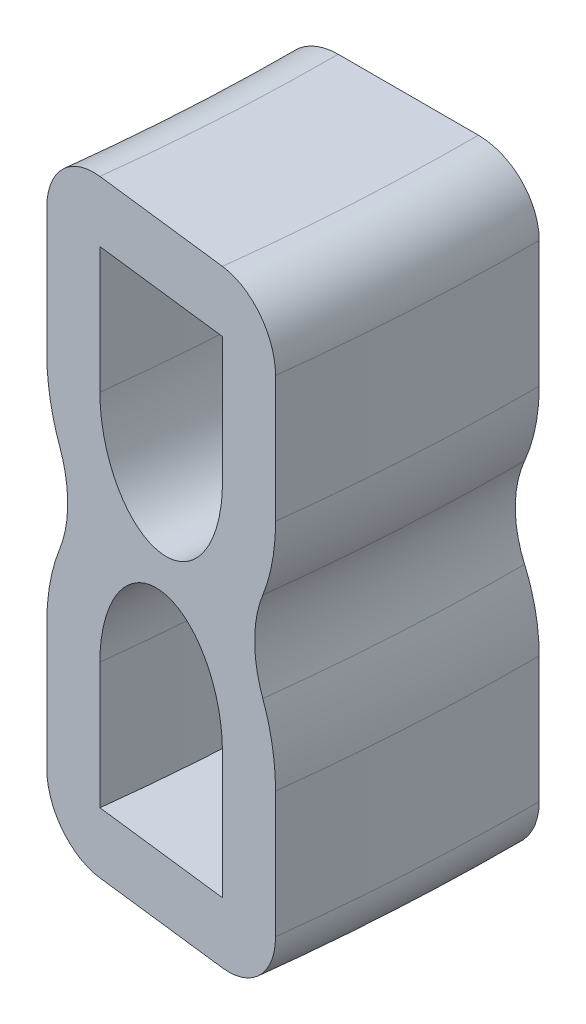
ISO-10303-21;
HEADER;
FILE_DESCRIPTION(('STEP AP214'),'2;1');
FILE_NAME('part.step','',(''),(''),'','','');
FILE_SCHEMA(('AUTOMOTIVE_DESIGN { 1 0 10303 214 1 1 1 1 }'));
ENDSEC;
DATA;
#1=APPLICATION_CONTEXT('core data for automotive mechanical design processes');
#2=APPLICATION_PROTOCOL_DEFINITION('international standard','automotive_design',2000,#1);
#3=PRODUCT_CONTEXT('',#1,'mechanical');
#4=PRODUCT('Part','Part','',(#3));
#5=PRODUCT_RELATED_PRODUCT_CATEGORY('part','',(#4));
#6=PRODUCT_DEFINITION_FORMATION('','',#4);
#7=PRODUCT_DEFINITION_CONTEXT('part definition',#1,'design');
#8=PRODUCT_DEFINITION('design','',#6,#7);
#9=PRODUCT_DEFINITION_SHAPE('','',#8);
#10=(LENGTH_UNIT() NAMED_UNIT(*) SI_UNIT(.MILLI.,.METRE.));
#11=(NAMED_UNIT(*) PLANE_ANGLE_UNIT() SI_UNIT($,.RADIAN.));
#12=(NAMED_UNIT(*) SI_UNIT($,.STERADIAN.) SOLID_ANGLE_UNIT());
#13=UNCERTAINTY_MEASURE_WITH_UNIT(LENGTH_MEASURE(1.E-05),#10,'distance_accuracy_value','');
#14=(GEOMETRIC_REPRESENTATION_CONTEXT(3) GLOBAL_UNCERTAINTY_ASSIGNED_CONTEXT((#13)) GLOBAL_UNIT_ASSIGNED_CONTEXT((#10,
#11,#12)) REPRESENTATION_CONTEXT('',''));
#15=CARTESIAN_POINT('',(0.,0.,0.));
#16=DIRECTION('',(0.,0.,1.));
#17=DIRECTION('',(1.,0.,0.));
#18=AXIS2_PLACEMENT_3D('',#15,#16,#17);
#19=CARTESIAN_POINT('',(-1.5,10.2,0.));
#20=DIRECTION('',(0.,1.,0.));
#21=DIRECTION('',(0.,0.,1.));
#22=AXIS2_PLACEMENT_3D('',#19,#20,#21);
#23=PLANE('',#22);
#24=CARTESIAN_POINT('',(-42.,10.2,0.));
#25=DIRECTION('',(0.,-1.,0.));
#26=DIRECTION('',(1.,0.,0.));
#27=AXIS2_PLACEMENT_3D('',#24,#25,#26);
#28=CIRCLE('',#27,40.5);
#29=CARTESIAN_POINT('',(-1.5,10.2,0.));
#30=VERTEX_POINT('',#29);
#31=CARTESIAN_POINT('',(-1.78698979591837,10.2,4.81287962933071));
#32=VERTEX_POINT('',#31);
#33=EDGE_CURVE('E280',#30,#32,#28,.T.);
#34=ORIENTED_EDGE('',*,*,#33,.T.);
#35=DIRECTION('',(-0.992913832199547,0.,-0.118836534057548));
#36=VECTOR('',#35,1.);
#37=CARTESIAN_POINT('',(-1.78698979591837,10.2,4.81287962933071));
#38=LINE('',#37,#36);
#39=CARTESIAN_POINT('',(1.19175170068027,10.2,5.16938923150335));
#40=VERTEX_POINT('',#39);
#41=EDGE_CURVE('E362',#40,#32,#38,.T.);
#42=ORIENTED_EDGE('',*,*,#41,.F.);
#43=CARTESIAN_POINT('',(-42.,10.2,0.));
#44=DIRECTION('',(0.,-1.,0.));
#45=DIRECTION('',(1.,0.,0.));
#46=AXIS2_PLACEMENT_3D('',#43,#44,#45);
#47=CIRCLE('',#46,43.5);
#48=CARTESIAN_POINT('',(1.5,10.2,0.));
#49=VERTEX_POINT('',#48);
#50=EDGE_CURVE('E285',#49,#40,#47,.T.);
#51=ORIENTED_EDGE('',*,*,#50,.F.);
#52=DIRECTION('',(-1.,0.,0.));
#53=VECTOR('',#52,1.);
#54=CARTESIAN_POINT('',(-1.5,10.2,0.));
#55=LINE('',#54,#53);
#56=EDGE_CURVE('E254',#49,#30,#55,.T.);
#57=ORIENTED_EDGE('',*,*,#56,.T.);
#58=EDGE_LOOP('',(#34,#42,#51,#57));
#59=FACE_BOUND('',#58,.T.);
#60=ADVANCED_FACE('F39',(#59),#23,.T.);
#61=CARTESIAN_POINT('',(-42.,8.9,0.));
#62=DIRECTION('',(0.,-1.,0.));
#63=DIRECTION('',(0.,0.,-1.));
#64=AXIS2_PLACEMENT_3D('',#61,#62,#63);
#65=TOROIDAL_SURFACE('',#64,40.5,1.3);
#66=CARTESIAN_POINT('',(-42.,8.9,0.));
#67=DIRECTION('',(0.,-1.,0.));
#68=DIRECTION('',(1.,0.,0.));
#69=AXIS2_PLACEMENT_3D('',#66,#67,#68);
#70=CIRCLE('',#69,39.2);
#71=CARTESIAN_POINT('',(-2.8,8.9,0.));
#72=VERTEX_POINT('',#71);
#73=CARTESIAN_POINT('',(-3.07777777777778,8.9,4.6583921350559));
#74=VERTEX_POINT('',#73);
#75=EDGE_CURVE('E284',#72,#74,#70,.T.);
#76=ORIENTED_EDGE('',*,*,#75,.T.);
#77=CARTESIAN_POINT('',(-1.78698979591837,8.9,4.81287962933071));
#78=DIRECTION('',(-0.118836534057548,0.,0.992913832199547));
#79=DIRECTION('',(0.992913832199547,0.,0.118836534057548));
#80=AXIS2_PLACEMENT_3D('',#77,#78,#79);
#81=CIRCLE('',#80,1.3);
#82=EDGE_CURVE('E216',#32,#74,#81,.T.);
#83=ORIENTED_EDGE('',*,*,#82,.F.);
#84=ORIENTED_EDGE('',*,*,#33,.F.);
#85=CARTESIAN_POINT('',(-1.5,8.9,0.));
#86=DIRECTION('',(0.,0.,1.));
#87=DIRECTION('',(1.,0.,0.));
#88=AXIS2_PLACEMENT_3D('',#85,#86,#87);
#89=CIRCLE('',#88,1.3);
#90=EDGE_CURVE('E251',#30,#72,#89,.T.);
#91=ORIENTED_EDGE('',*,*,#90,.T.);
#92=EDGE_LOOP('',(#76,#83,#84,#91));
#93=FACE_BOUND('',#92,.T.);
#94=ADVANCED_FACE('F694',(#93),#65,.T.);
#95=CARTESIAN_POINT('',(-42.,0.,0.));
#96=DIRECTION('',(0.,-1.,0.));
#97=DIRECTION('',(0.,0.,-1.));
#98=AXIS2_PLACEMENT_3D('',#95,#96,#97);
#99=CYLINDRICAL_SURFACE('',#98,39.2);
#100=CARTESIAN_POINT('',(-42.,6.2,0.));
#101=DIRECTION('',(0.,-1.,0.));
#102=DIRECTION('',(1.,0.,0.));
#103=AXIS2_PLACEMENT_3D('',#100,#101,#102);
#104=CIRCLE('',#103,39.2);
#105=CARTESIAN_POINT('',(-2.8,6.2,0.));
#106=VERTEX_POINT('',#105);
#107=CARTESIAN_POINT('',(-3.07777777777778,6.2,4.6583921350559));
#108=VERTEX_POINT('',#107);
#109=EDGE_CURVE('E292',#106,#108,#104,.T.);
#110=ORIENTED_EDGE('',*,*,#109,.T.);
#111=DIRECTION('',(0.,-1.,0.));
#112=VECTOR('',#111,1.);
#113=CARTESIAN_POINT('',(-3.07777777777778,8.9,4.6583921350559));
#114=LINE('',#113,#112);
#115=EDGE_CURVE('E220',#74,#108,#114,.T.);
#116=ORIENTED_EDGE('',*,*,#115,.F.);
#117=ORIENTED_EDGE('',*,*,#75,.F.);
#118=DIRECTION('',(0.,-1.,0.));
#119=VECTOR('',#118,1.);
#120=CARTESIAN_POINT('',(-2.8,8.9,0.));
#121=LINE('',#120,#119);
#122=EDGE_CURVE('E247',#72,#106,#121,.T.);
#123=ORIENTED_EDGE('',*,*,#122,.T.);
#124=EDGE_LOOP('',(#110,#116,#117,#123));
#125=FACE_BOUND('',#124,.T.);
#126=ADVANCED_FACE('F685',(#125),#99,.F.);
#127=CARTESIAN_POINT('',(-2.8,6.2,0.));
#128=CARTESIAN_POINT('',(-2.8,6.2,1.55739651651361));
#129=CARTESIAN_POINT('',(-2.89270217360201,6.2,3.11203159159014));
#130=CARTESIAN_POINT('',(-3.07777777777778,6.2,4.6583921350559));
#131=CARTESIAN_POINT('',(-2.8,5.65789056924837,0.));
#132=CARTESIAN_POINT('',(-2.8,5.65789056924837,1.55739651651361));
#133=CARTESIAN_POINT('',(-2.89270217360201,5.65789056924837,3.11203159159014));
#134=CARTESIAN_POINT('',(-3.07777777777778,5.65789056924837,4.6583921350559));
#135=CARTESIAN_POINT('',(-2.69365136890083,5.13316020158605,0.));
#136=CARTESIAN_POINT('',(-2.69365136890083,5.13316020158605,1.56162169476897));
#137=CARTESIAN_POINT('',(-2.78660504120852,5.13316020158605,3.12047445637848));
#138=CARTESIAN_POINT('',(-2.97218275092394,5.13316020158605,4.67103023777749));
#139=CARTESIAN_POINT('',(-2.48777280220747,4.65945273955546,0.));
#140=CARTESIAN_POINT('',(-2.48777280220747,4.65945273955546,1.56980114789634));
#141=CARTESIAN_POINT('',(-2.58121334672512,4.65945273955546,3.13681885953106));
#142=CARTESIAN_POINT('',(-2.76776307430068,4.65945273955546,4.69549613308006));
#143=(BOUNDED_SURFACE() B_SPLINE_SURFACE(3,3,((#127,#128,#129,#130),(#131,#132,#133,#134),(#135,
#136,#137,#138),(#139,#140,#141,#142)),.UNSPECIFIED.,.F.,.F.,
.F.) B_SPLINE_SURFACE_WITH_KNOTS((4,4),(4,4),(0.,1.),(0.,1.),
.UNSPECIFIED.) GEOMETRIC_REPRESENTATION_ITEM() RATIONAL_B_SPLINE_SURFACE(((1.,0.998817924055604,
0.998817924055604,1.),(0.978627853709388,0.977471041265003,0.977471041265003,0.978627853709388),
(0.978627853709388,0.977471041265003,0.977471041265003,0.978627853709388),(1.,0.998817924055604,
0.998817924055604,1.))) REPRESENTATION_ITEM('') SURFACE());
#144=CARTESIAN_POINT('',(-42.,4.65945273955546,0.));
#145=DIRECTION('',(0.,-1.,0.));
#146=DIRECTION('',(1.,0.,0.));
#147=AXIS2_PLACEMENT_3D('',#144,#145,#146);
#148=CIRCLE('',#147,39.5122271977925);
#149=CARTESIAN_POINT('',(-2.48777280220747,4.65945273955546,0.));
#150=VERTEX_POINT('',#149);
#151=CARTESIAN_POINT('',(-2.76776307430068,4.65945273955546,4.69549613308006));
#152=VERTEX_POINT('',#151);
#153=EDGE_CURVE('E296',#150,#152,#148,.T.);
#154=CARTESIAN_POINT('',(-0.620803255421781,6.2,4.95245424501531));
#155=DIRECTION('',(-0.118836534057548,0.,0.992913832199547));
#156=DIRECTION('',(0.,1.,0.));
#157=AXIS2_PLACEMENT_3D('',#154,#155,#156);
#158=ELLIPSE('',#157,3.16825385762719,2.47450931055437);
#159=EDGE_CURVE('E389',#108,#152,#158,.T.);
#160=CARTESIAN_POINT('',(-0.325490689445631,6.2,0.));
#161=DIRECTION('',(0.,0.,1.));
#162=DIRECTION('',(0.,1.,0.));
#163=AXIS2_PLACEMENT_3D('',#160,#161,#162);
#164=ELLIPSE('',#163,3.16825385762719,2.47450931055437);
#165=EDGE_CURVE('E250',#106,#150,#164,.T.);
#166=ORIENTED_EDGE('',*,*,#153,.T.);
#167=ORIENTED_EDGE('',*,*,#159,.F.);
#168=ORIENTED_EDGE('',*,*,#109,.F.);
#169=ORIENTED_EDGE('',*,*,#165,.T.);
#170=EDGE_LOOP('',(#166,#167,#168,#169));
#171=FACE_BOUND('',#170,.T.);
#172=ADVANCED_FACE('F676',(#171),#143,.T.);
#173=CARTESIAN_POINT('',(-42.,3.7,0.));
#174=DIRECTION('',(0.,-1.,0.));
#175=DIRECTION('',(0.,0.,-1.));
#176=AXIS2_PLACEMENT_3D('',#173,#174,#175);
#177=TOROIDAL_SURFACE('',#176,37.304615548397,2.40709342444103);
#178=CARTESIAN_POINT('',(-42.,2.74054726044454,0.));
#179=DIRECTION('',(0.,-1.,0.));
#180=DIRECTION('',(1.,0.,0.));
#181=AXIS2_PLACEMENT_3D('',#178,#179,#180);
#182=CIRCLE('',#181,39.5122271977925);
#183=CARTESIAN_POINT('',(-2.48777280220747,2.74054726044454,0.));
#184=VERTEX_POINT('',#183);
#185=CARTESIAN_POINT('',(-2.76776307430068,2.74054726044454,4.69549613308006));
#186=VERTEX_POINT('',#185);
#187=EDGE_CURVE('E300',#184,#186,#182,.T.);
#188=ORIENTED_EDGE('',*,*,#187,.T.);
#189=CARTESIAN_POINT('',(-4.95973121711033,3.7,4.43315121612083));
#190=DIRECTION('',(0.118836534057548,0.,-0.992913832199547));
#191=DIRECTION('',(0.992913832199547,0.,0.118836534057548));
#192=AXIS2_PLACEMENT_3D('',#189,#190,#191);
#193=CIRCLE('',#192,2.40709342444103);
#194=EDGE_CURVE('E385',#152,#186,#193,.T.);
#195=ORIENTED_EDGE('',*,*,#194,.F.);
#196=ORIENTED_EDGE('',*,*,#153,.F.);
#197=CARTESIAN_POINT('',(-4.69538445160298,3.7,0.));
#198=DIRECTION('',(0.,0.,-1.));
#199=DIRECTION('',(1.,0.,0.));
#200=AXIS2_PLACEMENT_3D('',#197,#198,#199);
#201=CIRCLE('',#200,2.40709342444103);
#202=EDGE_CURVE('E246',#150,#184,#201,.T.);
#203=ORIENTED_EDGE('',*,*,#202,.T.);
#204=EDGE_LOOP('',(#188,#195,#196,#203));
#205=FACE_BOUND('',#204,.T.);
#206=ADVANCED_FACE('F667',(#205),#177,.F.);
#207=CARTESIAN_POINT('',(-2.48777280220747,2.74054726044454,0.));
#208=CARTESIAN_POINT('',(-2.48777280220747,2.74054726044454,1.56980114789634));
#209=CARTESIAN_POINT('',(-2.58121334672512,2.74054726044454,3.13681885953106));
#210=CARTESIAN_POINT('',(-2.76776307430068,2.74054726044454,4.69549613308006));
#211=CARTESIAN_POINT('',(-2.69365136890083,2.26683979841396,0.));
#212=CARTESIAN_POINT('',(-2.69365136890083,2.26683979841396,1.56162169476897));
#213=CARTESIAN_POINT('',(-2.78660504120852,2.26683979841396,3.12047445637848));
#214=CARTESIAN_POINT('',(-2.97218275092394,2.26683979841396,4.67103023777749));
#215=CARTESIAN_POINT('',(-2.8,1.74210943075164,0.));
#216=CARTESIAN_POINT('',(-2.8,1.74210943075164,1.55739651651361));
#217=CARTESIAN_POINT('',(-2.89270217360201,1.74210943075164,3.11203159159014));
#218=CARTESIAN_POINT('',(-3.07777777777778,1.74210943075164,4.6583921350559));
#219=CARTESIAN_POINT('',(-2.8,1.2,0.));
#220=CARTESIAN_POINT('',(-2.8,1.2,1.55739651651361));
#221=CARTESIAN_POINT('',(-2.89270217360201,1.2,3.11203159159014));
#222=CARTESIAN_POINT('',(-3.07777777777778,1.2,4.6583921350559));
#223=(BOUNDED_SURFACE() B_SPLINE_SURFACE(3,3,((#207,#208,#209,#210),(#211,#212,#213,#214),(#215,
#216,#217,#218),(#219,#220,#221,#222)),.UNSPECIFIED.,.F.,.F.,
.F.) B_SPLINE_SURFACE_WITH_KNOTS((4,4),(4,4),(0.,1.),(0.,1.),
.UNSPECIFIED.) GEOMETRIC_REPRESENTATION_ITEM() RATIONAL_B_SPLINE_SURFACE(((1.,0.998817924055604,
0.998817924055604,1.),(0.978627853709388,0.977471041265003,0.977471041265003,0.978627853709388),
(0.978627853709388,0.977471041265003,0.977471041265003,0.978627853709388),(1.,0.998817924055604,
0.998817924055604,1.))) REPRESENTATION_ITEM('') SURFACE());
#224=CARTESIAN_POINT('',(-42.,1.2,0.));
#225=DIRECTION('',(0.,-1.,0.));
#226=DIRECTION('',(1.,0.,0.));
#227=AXIS2_PLACEMENT_3D('',#224,#225,#226);
#228=CIRCLE('',#227,39.2);
#229=CARTESIAN_POINT('',(-2.8,1.2,0.));
#230=VERTEX_POINT('',#229);
#231=CARTESIAN_POINT('',(-3.07777777777778,1.2,4.6583921350559));
#232=VERTEX_POINT('',#231);
#233=EDGE_CURVE('E304',#230,#232,#228,.T.);
#234=CARTESIAN_POINT('',(-0.620803255421781,1.2,4.95245424501531));
#235=DIRECTION('',(-0.118836534057548,0.,0.992913832199547));
#236=DIRECTION('',(0.,-1.,0.));
#237=AXIS2_PLACEMENT_3D('',#234,#235,#236);
#238=ELLIPSE('',#237,3.1682538576272,2.47450931055437);
#239=EDGE_CURVE('E384',#186,#232,#238,.T.);
#240=CARTESIAN_POINT('',(-0.325490689445631,1.2,0.));
#241=DIRECTION('',(0.,0.,1.));
#242=DIRECTION('',(0.,-1.,0.));
#243=AXIS2_PLACEMENT_3D('',#240,#241,#242);
#244=ELLIPSE('',#243,3.1682538576272,2.47450931055437);
#245=EDGE_CURVE('E242',#184,#230,#244,.T.);
#246=ORIENTED_EDGE('',*,*,#233,.T.);
#247=ORIENTED_EDGE('',*,*,#239,.F.);
#248=ORIENTED_EDGE('',*,*,#187,.F.);
#249=ORIENTED_EDGE('',*,*,#245,.T.);
#250=EDGE_LOOP('',(#246,#247,#248,#249));
#251=FACE_BOUND('',#250,.T.);
#252=ADVANCED_FACE('F658',(#251),#223,.T.);
#253=CARTESIAN_POINT('',(-42.,0.,0.));
#254=DIRECTION('',(0.,-1.,0.));
#255=DIRECTION('',(0.,0.,-1.));
#256=AXIS2_PLACEMENT_3D('',#253,#254,#255);
#257=CYLINDRICAL_SURFACE('',#256,39.2);
#258=CARTESIAN_POINT('',(-42.,-1.5,0.));
#259=DIRECTION('',(0.,-1.,0.));
#260=DIRECTION('',(1.,0.,0.));
#261=AXIS2_PLACEMENT_3D('',#258,#259,#260);
#262=CIRCLE('',#261,39.2);
#263=CARTESIAN_POINT('',(-2.8,-1.5,0.));
#264=VERTEX_POINT('',#263);
#265=CARTESIAN_POINT('',(-3.07777777777778,-1.5,4.6583921350559));
#266=VERTEX_POINT('',#265);
#267=EDGE_CURVE('E308',#264,#266,#262,.T.);
#268=ORIENTED_EDGE('',*,*,#267,.T.);
#269=DIRECTION('',(0.,-1.,0.));
#270=VECTOR('',#269,1.);
#271=CARTESIAN_POINT('',(-3.07777777777778,-1.5,4.6583921350559));
#272=LINE('',#271,#270);
#273=EDGE_CURVE('E380',#232,#266,#272,.T.);
#274=ORIENTED_EDGE('',*,*,#273,.F.);
#275=ORIENTED_EDGE('',*,*,#233,.F.);
#276=DIRECTION('',(0.,-1.,0.));
#277=VECTOR('',#276,1.);
#278=CARTESIAN_POINT('',(-2.8,-1.5,0.));
#279=LINE('',#278,#277);
#280=EDGE_CURVE('E245',#230,#264,#279,.T.);
#281=ORIENTED_EDGE('',*,*,#280,.T.);
#282=EDGE_LOOP('',(#268,#274,#275,#281));
#283=FACE_BOUND('',#282,.T.);
#284=ADVANCED_FACE('F649',(#283),#257,.F.);
#285=CARTESIAN_POINT('',(-42.,-1.5,0.));
#286=DIRECTION('',(0.,-1.,0.));
#287=DIRECTION('',(0.,0.,-1.));
#288=AXIS2_PLACEMENT_3D('',#285,#286,#287);
#289=TOROIDAL_SURFACE('',#288,40.5,1.3);
#290=CARTESIAN_POINT('',(-42.,-2.8,0.));
#291=DIRECTION('',(0.,-1.,0.));
#292=DIRECTION('',(1.,0.,0.));
#293=AXIS2_PLACEMENT_3D('',#290,#291,#292);
#294=CIRCLE('',#293,40.5);
#295=CARTESIAN_POINT('',(-1.5,-2.8,0.));
#296=VERTEX_POINT('',#295);
#297=CARTESIAN_POINT('',(-1.78698979591837,-2.8,4.81287962933071));
#298=VERTEX_POINT('',#297);
#299=EDGE_CURVE('E312',#296,#298,#294,.T.);
#300=ORIENTED_EDGE('',*,*,#299,.T.);
#301=CARTESIAN_POINT('',(-1.78698979591837,-1.5,4.81287962933071));
#302=DIRECTION('',(-0.118836534057548,0.,0.992913832199547));
#303=DIRECTION('',(-0.992913832199547,0.,-0.118836534057548));
#304=AXIS2_PLACEMENT_3D('',#301,#302,#303);
#305=CIRCLE('',#304,1.3);
#306=EDGE_CURVE('E375',#266,#298,#305,.T.);
#307=ORIENTED_EDGE('',*,*,#306,.F.);
#308=ORIENTED_EDGE('',*,*,#267,.F.);
#309=CARTESIAN_POINT('',(-1.5,-1.5,0.));
#310=DIRECTION('',(0.,0.,1.));
#311=DIRECTION('',(-1.,0.,0.));
#312=AXIS2_PLACEMENT_3D('',#309,#310,#311);
#313=CIRCLE('',#312,1.3);
#314=EDGE_CURVE('E241',#264,#296,#313,.T.);
#315=ORIENTED_EDGE('',*,*,#314,.T.);
#316=EDGE_LOOP('',(#300,#307,#308,#315));
#317=FACE_BOUND('',#316,.T.);
#318=ADVANCED_FACE('F640',(#317),#289,.T.);
#319=CARTESIAN_POINT('',(-1.5,-2.8,0.));
#320=DIRECTION('',(0.,-1.,0.));
#321=DIRECTION('',(0.,0.,-1.));
#322=AXIS2_PLACEMENT_3D('',#319,#320,#321);
#323=PLANE('',#322);
#324=CARTESIAN_POINT('',(-42.,-2.8,0.));
#325=DIRECTION('',(0.,-1.,0.));
#326=DIRECTION('',(1.,0.,0.));
#327=AXIS2_PLACEMENT_3D('',#324,#325,#326);
#328=CIRCLE('',#327,43.5);
#329=CARTESIAN_POINT('',(1.5,-2.8,0.));
#330=VERTEX_POINT('',#329);
#331=CARTESIAN_POINT('',(1.19175170068027,-2.8,5.16938923150335));
#332=VERTEX_POINT('',#331);
#333=EDGE_CURVE('E316',#330,#332,#328,.T.);
#334=ORIENTED_EDGE('',*,*,#333,.T.);
#335=DIRECTION('',(0.992913832199547,0.,0.118836534057548));
#336=VECTOR('',#335,1.);
#337=CARTESIAN_POINT('',(-1.78698979591837,-2.8,4.81287962933071));
#338=LINE('',#337,#336);
#339=EDGE_CURVE('E379',#298,#332,#338,.T.);
#340=ORIENTED_EDGE('',*,*,#339,.F.);
#341=ORIENTED_EDGE('',*,*,#299,.F.);
#342=DIRECTION('',(1.,0.,0.));
#343=VECTOR('',#342,1.);
#344=CARTESIAN_POINT('',(-1.5,-2.8,0.));
#345=LINE('',#344,#343);
#346=EDGE_CURVE('E238',#296,#330,#345,.T.);
#347=ORIENTED_EDGE('',*,*,#346,.T.);
#348=EDGE_LOOP('',(#334,#340,#341,#347));
#349=FACE_BOUND('',#348,.T.);
#350=ADVANCED_FACE('F631',(#349),#323,.T.);
#351=CARTESIAN_POINT('',(-42.,-1.5,0.));
#352=DIRECTION('',(0.,-1.,0.));
#353=DIRECTION('',(0.,0.,-1.));
#354=AXIS2_PLACEMENT_3D('',#351,#352,#353);
#355=TOROIDAL_SURFACE('',#354,43.5,1.3);
#356=CARTESIAN_POINT('',(-42.,-1.5,0.));
#357=DIRECTION('',(0.,-1.,0.));
#358=DIRECTION('',(1.,0.,0.));
#359=AXIS2_PLACEMENT_3D('',#356,#357,#358);
#360=CIRCLE('',#359,44.8);
#361=CARTESIAN_POINT('',(2.8,-1.5,0.));
#362=VERTEX_POINT('',#361);
#363=CARTESIAN_POINT('',(2.48253968253968,-1.5,5.32387672577817));
#364=VERTEX_POINT('',#363);
#365=EDGE_CURVE('E320',#362,#364,#360,.T.);
#366=ORIENTED_EDGE('',*,*,#365,.T.);
#367=CARTESIAN_POINT('',(1.19175170068027,-1.5,5.16938923150335));
#368=DIRECTION('',(-0.118836534057548,0.,0.992913832199547));
#369=DIRECTION('',(0.992913832199547,0.,0.118836534057548));
#370=AXIS2_PLACEMENT_3D('',#367,#368,#369);
#371=CIRCLE('',#370,1.3);
#372=EDGE_CURVE('E405',#332,#364,#371,.T.);
#373=ORIENTED_EDGE('',*,*,#372,.F.);
#374=ORIENTED_EDGE('',*,*,#333,.F.);
#375=CARTESIAN_POINT('',(1.5,-1.5,0.));
#376=DIRECTION('',(0.,0.,1.));
#377=DIRECTION('',(1.,0.,0.));
#378=AXIS2_PLACEMENT_3D('',#375,#376,#377);
#379=CIRCLE('',#378,1.3);
#380=EDGE_CURVE('E235',#330,#362,#379,.T.);
#381=ORIENTED_EDGE('',*,*,#380,.T.);
#382=EDGE_LOOP('',(#366,#373,#374,#381));
#383=FACE_BOUND('',#382,.T.);
#384=ADVANCED_FACE('F622',(#383),#355,.T.);
#385=CARTESIAN_POINT('',(-42.,0.,0.));
#386=DIRECTION('',(0.,-1.,0.));
#387=DIRECTION('',(0.,0.,-1.));
#388=AXIS2_PLACEMENT_3D('',#385,#386,#387);
#389=CYLINDRICAL_SURFACE('',#388,44.8);
#390=CARTESIAN_POINT('',(-42.,1.2,0.));
#391=DIRECTION('',(0.,-1.,0.));
#392=DIRECTION('',(1.,0.,0.));
#393=AXIS2_PLACEMENT_3D('',#390,#391,#392);
#394=CIRCLE('',#393,44.8);
#395=CARTESIAN_POINT('',(2.8,1.2,0.));
#396=VERTEX_POINT('',#395);
#397=CARTESIAN_POINT('',(2.48253968253968,1.2,5.32387672577817));
#398=VERTEX_POINT('',#397);
#399=EDGE_CURVE('E324',#396,#398,#394,.T.);
#400=ORIENTED_EDGE('',*,*,#399,.T.);
#401=DIRECTION('',(0.,1.,0.));
#402=VECTOR('',#401,1.);
#403=CARTESIAN_POINT('',(2.48253968253968,-1.5,5.32387672577817));
#404=LINE('',#403,#402);
#405=EDGE_CURVE('E374',#364,#398,#404,.T.);
#406=ORIENTED_EDGE('',*,*,#405,.F.);
#407=ORIENTED_EDGE('',*,*,#365,.F.);
#408=DIRECTION('',(0.,1.,0.));
#409=VECTOR('',#408,1.);
#410=CARTESIAN_POINT('',(2.8,-1.5,0.));
#411=LINE('',#410,#409);
#412=EDGE_CURVE('E232',#362,#396,#411,.T.);
#413=ORIENTED_EDGE('',*,*,#412,.T.);
#414=EDGE_LOOP('',(#400,#406,#407,#413));
#415=FACE_BOUND('',#414,.T.);
#416=ADVANCED_FACE('F613',(#415),#389,.T.);
#417=CARTESIAN_POINT('',(2.8,1.2,0.));
#418=CARTESIAN_POINT('',(2.8,1.2,1.77988173315841));
#419=CARTESIAN_POINT('',(2.69405465874056,1.2,3.55660753324588));
#420=CARTESIAN_POINT('',(2.48253968253967,1.2,5.32387672577817));
#421=CARTESIAN_POINT('',(2.8,1.74210943075164,0.));
#422=CARTESIAN_POINT('',(2.8,1.74210943075164,1.77988173315841));
#423=CARTESIAN_POINT('',(2.69405465874056,1.74210943075164,3.55660753324588));
#424=CARTESIAN_POINT('',(2.48253968253967,1.74210943075164,5.32387672577817));
#425=CARTESIAN_POINT('',(2.69365136890083,2.26683979841396,0.));
#426=CARTESIAN_POINT('',(2.69365136890083,2.26683979841396,1.77565655490306));
#427=CARTESIAN_POINT('',(2.58795752634707,2.26683979841396,3.54816466845753));
#428=CARTESIAN_POINT('',(2.37694465568583,2.26683979841396,5.31123862305658));
#429=CARTESIAN_POINT('',(2.48777280220747,2.74054726044454,0.));
#430=CARTESIAN_POINT('',(2.48777280220747,2.74054726044454,1.76747710177569));
#431=CARTESIAN_POINT('',(2.38256583186368,2.74054726044454,3.53182026530496));
#432=CARTESIAN_POINT('',(2.17252497906257,2.74054726044454,5.286772727754));
#433=(BOUNDED_SURFACE() B_SPLINE_SURFACE(3,3,((#417,#418,#419,#420),(#421,#422,#423,#424),(#425,
#426,#427,#428),(#429,#430,#431,#432)),.UNSPECIFIED.,.F.,.F.,
.F.) B_SPLINE_SURFACE_WITH_KNOTS((4,4),(4,4),(0.,1.),(0.,1.),
.UNSPECIFIED.) GEOMETRIC_REPRESENTATION_ITEM() RATIONAL_B_SPLINE_SURFACE(((1.,0.998817924055604,
0.998817924055604,1.),(0.978627853709388,0.977471041265003,0.977471041265003,0.978627853709388),
(0.978627853709388,0.977471041265003,0.977471041265003,0.978627853709388),(1.,0.998817924055604,
0.998817924055604,1.))) REPRESENTATION_ITEM('') SURFACE());
#434=CARTESIAN_POINT('',(-42.,2.74054726044454,0.));
#435=DIRECTION('',(0.,-1.,0.));
#436=DIRECTION('',(1.,0.,0.));
#437=AXIS2_PLACEMENT_3D('',#434,#435,#436);
#438=CIRCLE('',#437,44.4877728022075);
#439=CARTESIAN_POINT('',(2.48777280220747,2.74054726044454,0.));
#440=VERTEX_POINT('',#439);
#441=CARTESIAN_POINT('',(2.17252497906258,2.74054726044454,5.286772727754));
#442=VERTEX_POINT('',#441);
#443=EDGE_CURVE('E328',#440,#442,#438,.T.);
#444=CARTESIAN_POINT('',(0.0255651601836868,1.2,5.02981461581875));
#445=DIRECTION('',(-0.118836534057548,0.,0.992913832199547));
#446=DIRECTION('',(0.,-1.,0.));
#447=AXIS2_PLACEMENT_3D('',#444,#445,#446);
#448=ELLIPSE('',#447,3.1682538576272,2.47450931055437);
#449=EDGE_CURVE('E367',#398,#442,#448,.T.);
#450=CARTESIAN_POINT('',(0.325490689445631,1.2,0.));
#451=DIRECTION('',(0.,0.,1.));
#452=DIRECTION('',(0.,-1.,0.));
#453=AXIS2_PLACEMENT_3D('',#450,#451,#452);
#454=ELLIPSE('',#453,3.1682538576272,2.47450931055437);
#455=EDGE_CURVE('E231',#396,#440,#454,.T.);
#456=ORIENTED_EDGE('',*,*,#443,.T.);
#457=ORIENTED_EDGE('',*,*,#449,.F.);
#458=ORIENTED_EDGE('',*,*,#399,.F.);
#459=ORIENTED_EDGE('',*,*,#455,.T.);
#460=EDGE_LOOP('',(#456,#457,#458,#459));
#461=FACE_BOUND('',#460,.T.);
#462=ADVANCED_FACE('F604',(#461),#433,.T.);
#463=CARTESIAN_POINT('',(-42.,3.7,0.));
#464=DIRECTION('',(0.,-1.,0.));
#465=DIRECTION('',(0.,0.,-1.));
#466=AXIS2_PLACEMENT_3D('',#463,#464,#465);
#467=TOROIDAL_SURFACE('',#466,46.695384451603,2.40709342444103);
#468=CARTESIAN_POINT('',(-42.,4.65945273955546,0.));
#469=DIRECTION('',(0.,-1.,0.));
#470=DIRECTION('',(1.,0.,0.));
#471=AXIS2_PLACEMENT_3D('',#468,#469,#470);
#472=CIRCLE('',#471,44.4877728022075);
#473=CARTESIAN_POINT('',(2.48777280220747,4.65945273955546,0.));
#474=VERTEX_POINT('',#473);
#475=CARTESIAN_POINT('',(2.17252497906258,4.65945273955546,5.286772727754));
#476=VERTEX_POINT('',#475);
#477=EDGE_CURVE('E332',#474,#476,#472,.T.);
#478=ORIENTED_EDGE('',*,*,#477,.T.);
#479=CARTESIAN_POINT('',(4.36449312187224,3.7,5.54911764471323));
#480=DIRECTION('',(0.118836534057548,0.,-0.992913832199547));
#481=DIRECTION('',(-0.992913832199547,0.,-0.118836534057548));
#482=AXIS2_PLACEMENT_3D('',#479,#480,#481);
#483=CIRCLE('',#482,2.40709342444103);
#484=EDGE_CURVE('E364',#442,#476,#483,.T.);
#485=ORIENTED_EDGE('',*,*,#484,.F.);
#486=ORIENTED_EDGE('',*,*,#443,.F.);
#487=CARTESIAN_POINT('',(4.69538445160298,3.7,0.));
#488=DIRECTION('',(0.,0.,-1.));
#489=DIRECTION('',(-1.,0.,0.));
#490=AXIS2_PLACEMENT_3D('',#487,#488,#489);
#491=CIRCLE('',#490,2.40709342444103);
#492=EDGE_CURVE('E228',#440,#474,#491,.T.);
#493=ORIENTED_EDGE('',*,*,#492,.T.);
#494=EDGE_LOOP('',(#478,#485,#486,#493));
#495=FACE_BOUND('',#494,.T.);
#496=ADVANCED_FACE('F596',(#495),#467,.F.);
#497=CARTESIAN_POINT('',(2.48777280220747,4.65945273955546,0.));
#498=CARTESIAN_POINT('',(2.48777280220747,4.65945273955546,1.76747710177569));
#499=CARTESIAN_POINT('',(2.38256583186368,4.65945273955546,3.53182026530496));
#500=CARTESIAN_POINT('',(2.17252497906257,4.65945273955546,5.286772727754));
#501=CARTESIAN_POINT('',(2.69365136890083,5.13316020158605,0.));
#502=CARTESIAN_POINT('',(2.69365136890083,5.13316020158605,1.77565655490306));
#503=CARTESIAN_POINT('',(2.58795752634707,5.13316020158605,3.54816466845753));
#504=CARTESIAN_POINT('',(2.37694465568583,5.13316020158605,5.31123862305658));
#505=CARTESIAN_POINT('',(2.8,5.65789056924836,0.));
#506=CARTESIAN_POINT('',(2.8,5.65789056924836,1.77988173315841));
#507=CARTESIAN_POINT('',(2.69405465874056,5.65789056924836,3.55660753324588));
#508=CARTESIAN_POINT('',(2.48253968253967,5.65789056924836,5.32387672577817));
#509=CARTESIAN_POINT('',(2.8,6.2,0.));
#510=CARTESIAN_POINT('',(2.8,6.2,1.77988173315841));
#511=CARTESIAN_POINT('',(2.69405465874056,6.2,3.55660753324588));
#512=CARTESIAN_POINT('',(2.48253968253967,6.2,5.32387672577817));
#513=(BOUNDED_SURFACE() B_SPLINE_SURFACE(3,3,((#497,#498,#499,#500),(#501,#502,#503,#504),(#505,
#506,#507,#508),(#509,#510,#511,#512)),.UNSPECIFIED.,.F.,.F.,
.F.) B_SPLINE_SURFACE_WITH_KNOTS((4,4),(4,4),(0.,1.),(0.,1.),
.UNSPECIFIED.) GEOMETRIC_REPRESENTATION_ITEM() RATIONAL_B_SPLINE_SURFACE(((1.,0.998817924055604,
0.998817924055604,1.),(0.978627853709388,0.977471041265003,0.977471041265003,0.978627853709388),
(0.978627853709388,0.977471041265003,0.977471041265003,0.978627853709388),(1.,0.998817924055604,
0.998817924055604,1.))) REPRESENTATION_ITEM('') SURFACE());
#514=CARTESIAN_POINT('',(-42.,6.2,0.));
#515=DIRECTION('',(0.,-1.,0.));
#516=DIRECTION('',(1.,0.,0.));
#517=AXIS2_PLACEMENT_3D('',#514,#515,#516);
#518=CIRCLE('',#517,44.8);
#519=CARTESIAN_POINT('',(2.8,6.2,0.));
#520=VERTEX_POINT('',#519);
#521=CARTESIAN_POINT('',(2.48253968253968,6.2,5.32387672577817));
#522=VERTEX_POINT('',#521);
#523=EDGE_CURVE('E335',#520,#522,#518,.T.);
#524=CARTESIAN_POINT('',(0.0255651601836868,6.2,5.02981461581875));
#525=DIRECTION('',(-0.118836534057548,0.,0.992913832199547));
#526=DIRECTION('',(0.,1.,0.));
#527=AXIS2_PLACEMENT_3D('',#524,#525,#526);
#528=ELLIPSE('',#527,3.16825385762719,2.47450931055437);
#529=EDGE_CURVE('E357',#476,#522,#528,.T.);
#530=CARTESIAN_POINT('',(0.325490689445631,6.2,0.));
#531=DIRECTION('',(0.,0.,1.));
#532=DIRECTION('',(0.,1.,0.));
#533=AXIS2_PLACEMENT_3D('',#530,#531,#532);
#534=ELLIPSE('',#533,3.16825385762719,2.47450931055437);
#535=EDGE_CURVE('E224',#474,#520,#534,.T.);
#536=ORIENTED_EDGE('',*,*,#523,.T.);
#537=ORIENTED_EDGE('',*,*,#529,.F.);
#538=ORIENTED_EDGE('',*,*,#477,.F.);
#539=ORIENTED_EDGE('',*,*,#535,.T.);
#540=EDGE_LOOP('',(#536,#537,#538,#539));
#541=FACE_BOUND('',#540,.T.);
#542=ADVANCED_FACE('F589',(#541),#513,.T.);
#543=CARTESIAN_POINT('',(-42.,0.,0.));
#544=DIRECTION('',(0.,-1.,0.));
#545=DIRECTION('',(0.,0.,-1.));
#546=AXIS2_PLACEMENT_3D('',#543,#544,#545);
#547=CYLINDRICAL_SURFACE('',#546,44.8);
#548=CARTESIAN_POINT('',(-42.,8.9,0.));
#549=DIRECTION('',(0.,-1.,0.));
#550=DIRECTION('',(1.,0.,0.));
#551=AXIS2_PLACEMENT_3D('',#548,#549,#550);
#552=CIRCLE('',#551,44.8);
#553=CARTESIAN_POINT('',(2.8,8.9,0.));
#554=VERTEX_POINT('',#553);
#555=CARTESIAN_POINT('',(2.48253968253968,8.9,5.32387672577817));
#556=VERTEX_POINT('',#555);
#557=EDGE_CURVE('E43',#554,#556,#552,.T.);
#558=ORIENTED_EDGE('',*,*,#557,.T.);
#559=DIRECTION('',(0.,1.,0.));
#560=VECTOR('',#559,1.);
#561=CARTESIAN_POINT('',(2.48253968253968,8.9,5.32387672577817));
#562=LINE('',#561,#560);
#563=EDGE_CURVE('E347',#522,#556,#562,.T.);
#564=ORIENTED_EDGE('',*,*,#563,.F.);
#565=ORIENTED_EDGE('',*,*,#523,.F.);
#566=DIRECTION('',(0.,1.,0.));
#567=VECTOR('',#566,1.);
#568=CARTESIAN_POINT('',(2.8,8.9,0.));
#569=LINE('',#568,#567);
#570=EDGE_CURVE('E227',#520,#554,#569,.T.);
#571=ORIENTED_EDGE('',*,*,#570,.T.);
#572=EDGE_LOOP('',(#558,#564,#565,#571));
#573=FACE_BOUND('',#572,.T.);
#574=ADVANCED_FACE('F346',(#573),#547,.T.);
#575=CARTESIAN_POINT('',(-42.,8.9,0.));
#576=DIRECTION('',(0.,-1.,0.));
#577=DIRECTION('',(0.,0.,-1.));
#578=AXIS2_PLACEMENT_3D('',#575,#576,#577);
#579=TOROIDAL_SURFACE('',#578,43.5,1.3);
#580=CARTESIAN_POINT('',(1.19175170068027,8.9,5.16938923150335));
#581=DIRECTION('',(-0.118836534057548,0.,0.992913832199547));
#582=DIRECTION('',(-0.992913832199547,0.,-0.118836534057548));
#583=AXIS2_PLACEMENT_3D('',#580,#581,#582);
#584=CIRCLE('',#583,1.3);
#585=EDGE_CURVE('E355',#556,#40,#584,.T.);
#586=ORIENTED_EDGE('',*,*,#585,.F.);
#587=ORIENTED_EDGE('',*,*,#557,.F.);
#588=CARTESIAN_POINT('',(1.5,8.9,0.));
#589=DIRECTION('',(0.,0.,1.));
#590=DIRECTION('',(-1.,0.,0.));
#591=AXIS2_PLACEMENT_3D('',#588,#589,#590);
#592=CIRCLE('',#591,1.3);
#593=EDGE_CURVE('E257',#554,#49,#592,.T.);
#594=ORIENTED_EDGE('',*,*,#593,.T.);
#595=ORIENTED_EDGE('',*,*,#50,.T.);
#596=EDGE_LOOP('',(#586,#587,#594,#595));
#597=FACE_BOUND('',#596,.T.);
#598=ADVANCED_FACE('F41',(#597),#579,.T.);
#599=CARTESIAN_POINT('',(-1.5,-1.5,0.));
#600=DIRECTION('',(0.,1.,0.));
#601=DIRECTION('',(0.,0.,1.));
#602=AXIS2_PLACEMENT_3D('',#599,#600,#601);
#603=PLANE('',#602);
#604=CARTESIAN_POINT('',(-42.,-1.5,0.));
#605=DIRECTION('',(0.,-1.,0.));
#606=DIRECTION('',(1.,0.,0.));
#607=AXIS2_PLACEMENT_3D('',#604,#605,#606);
#608=CIRCLE('',#607,40.5);
#609=CARTESIAN_POINT('',(-1.5,-1.5,0.));
#610=VERTEX_POINT('',#609);
#611=CARTESIAN_POINT('',(-1.78698979591837,-1.5,4.81287962933071));
#612=VERTEX_POINT('',#611);
#613=EDGE_CURVE('E196',#610,#612,#608,.T.);
#614=ORIENTED_EDGE('',*,*,#613,.T.);
#615=DIRECTION('',(0.992913832199547,0.,0.118836534057548));
#616=VECTOR('',#615,1.);
#617=CARTESIAN_POINT('',(-1.78698979591837,-1.5,4.81287962933071));
#618=LINE('',#617,#616);
#619=CARTESIAN_POINT('',(1.19175170068027,-1.5,5.16938923150335));
#620=VERTEX_POINT('',#619);
#621=EDGE_CURVE('E420',#612,#620,#618,.T.);
#622=ORIENTED_EDGE('',*,*,#621,.T.);
#623=CARTESIAN_POINT('',(-42.,-1.5,0.));
#624=DIRECTION('',(0.,-1.,0.));
#625=DIRECTION('',(1.,0.,0.));
#626=AXIS2_PLACEMENT_3D('',#623,#624,#625);
#627=CIRCLE('',#626,43.5);
#628=CARTESIAN_POINT('',(1.5,-1.5,0.));
#629=VERTEX_POINT('',#628);
#630=EDGE_CURVE('E274',#629,#620,#627,.T.);
#631=ORIENTED_EDGE('',*,*,#630,.F.);
#632=DIRECTION('',(1.,0.,0.));
#633=VECTOR('',#632,1.);
#634=CARTESIAN_POINT('',(-1.5,-1.5,0.));
#635=LINE('',#634,#633);
#636=EDGE_CURVE('E185',#610,#629,#635,.T.);
#637=ORIENTED_EDGE('',*,*,#636,.F.);
#638=EDGE_LOOP('',(#614,#622,#631,#637));
#639=FACE_BOUND('',#638,.T.);
#640=ADVANCED_FACE('F569',(#639),#603,.T.);
#641=CARTESIAN_POINT('',(-42.,0.,0.));
#642=DIRECTION('',(0.,-1.,0.));
#643=DIRECTION('',(0.,0.,-1.));
#644=AXIS2_PLACEMENT_3D('',#641,#642,#643);
#645=CYLINDRICAL_SURFACE('',#644,40.5);
#646=CARTESIAN_POINT('',(-42.,1.2,0.));
#647=DIRECTION('',(0.,-1.,0.));
#648=DIRECTION('',(1.,0.,0.));
#649=AXIS2_PLACEMENT_3D('',#646,#647,#648);
#650=CIRCLE('',#649,40.5);
#651=CARTESIAN_POINT('',(-1.5,1.2,0.));
#652=VERTEX_POINT('',#651);
#653=CARTESIAN_POINT('',(-1.78698979591837,1.2,4.81287962933071));
#654=VERTEX_POINT('',#653);
#655=EDGE_CURVE('E194',#652,#654,#650,.T.);
#656=ORIENTED_EDGE('',*,*,#655,.T.);
#657=DIRECTION('',(0.,-1.,0.));
#658=VECTOR('',#657,1.);
#659=CARTESIAN_POINT('',(-1.78698979591837,-1.5,4.81287962933071));
#660=LINE('',#659,#658);
#661=EDGE_CURVE('E417',#654,#612,#660,.T.);
#662=ORIENTED_EDGE('',*,*,#661,.T.);
#663=ORIENTED_EDGE('',*,*,#613,.F.);
#664=DIRECTION('',(0.,-1.,0.));
#665=VECTOR('',#664,1.);
#666=CARTESIAN_POINT('',(-1.5,-1.5,0.));
#667=LINE('',#666,#665);
#668=EDGE_CURVE('E191',#652,#610,#667,.T.);
#669=ORIENTED_EDGE('',*,*,#668,.F.);
#670=EDGE_LOOP('',(#656,#662,#663,#669));
#671=FACE_BOUND('',#670,.T.);
#672=ADVANCED_FACE('F193',(#671),#645,.T.);
#673=CARTESIAN_POINT('',(-1.5,1.2,0.));
#674=CARTESIAN_POINT('',(-1.5,1.2,1.60904487037758));
#675=CARTESIAN_POINT('',(-1.59577648037962,1.2,3.21523672090308));
#676=CARTESIAN_POINT('',(-1.78698979591837,1.2,4.81287962933071));
#677=CARTESIAN_POINT('',(-1.5,5.5,0.));
#678=CARTESIAN_POINT('',(-1.5,5.5,1.60904487037758));
#679=CARTESIAN_POINT('',(-1.59577648037962,5.5,3.21523672090308));
#680=CARTESIAN_POINT('',(-1.78698979591837,5.5,4.81287962933071));
#681=CARTESIAN_POINT('',(1.5,5.5,0.));
#682=CARTESIAN_POINT('',(1.5,5.5,1.72823337929444));
#683=CARTESIAN_POINT('',(1.39712896551818,5.5,3.45340240393294));
#684=CARTESIAN_POINT('',(1.19175170068027,5.5,5.16938923150335));
#685=CARTESIAN_POINT('',(1.5,1.2,0.));
#686=CARTESIAN_POINT('',(1.5,1.2,1.72823337929444));
#687=CARTESIAN_POINT('',(1.39712896551818,1.2,3.45340240393294));
#688=CARTESIAN_POINT('',(1.19175170068026,1.2,5.16938923150335));
#689=(BOUNDED_SURFACE() B_SPLINE_SURFACE(3,3,((#673,#674,#675,#676),(#677,#678,#679,#680),(#681,
#682,#683,#684),(#685,#686,#687,#688)),.UNSPECIFIED.,.F.,.F.,
.F.) B_SPLINE_SURFACE_WITH_KNOTS((4,4),(4,4),(0.,1.),(0.,1.),
.UNSPECIFIED.) GEOMETRIC_REPRESENTATION_ITEM() RATIONAL_B_SPLINE_SURFACE(((1.,0.998817924055604,
0.998817924055604,1.),(0.333333333333333,0.332939308018535,0.332939308018535,0.333333333333333),
(0.333333333333333,0.332939308018535,0.332939308018535,0.333333333333333),(1.,0.998817924055604,
0.998817924055604,1.))) REPRESENTATION_ITEM('') SURFACE());
#690=CARTESIAN_POINT('',(-42.,1.2,0.));
#691=DIRECTION('',(0.,-1.,0.));
#692=DIRECTION('',(1.,0.,0.));
#693=AXIS2_PLACEMENT_3D('',#690,#691,#692);
#694=CIRCLE('',#693,43.5);
#695=CARTESIAN_POINT('',(1.5,1.2,0.));
#696=VERTEX_POINT('',#695);
#697=CARTESIAN_POINT('',(1.19175170068027,1.2,5.16938923150335));
#698=VERTEX_POINT('',#697);
#699=EDGE_CURVE('E209',#696,#698,#694,.T.);
#700=CARTESIAN_POINT('',(-0.297619047619047,1.2,4.99113443041703));
#701=DIRECTION('',(-0.118836534057548,0.,0.992913832199547));
#702=DIRECTION('',(0.,1.,0.));
#703=AXIS2_PLACEMENT_3D('',#700,#701,#702);
#704=ELLIPSE('',#703,2.15,1.5);
#705=EDGE_CURVE('E207',#698,#654,#704,.T.);
#706=CARTESIAN_POINT('',(0.,1.2,0.));
#707=DIRECTION('',(0.,0.,1.));
#708=DIRECTION('',(0.,1.,0.));
#709=AXIS2_PLACEMENT_3D('',#706,#707,#708);
#710=ELLIPSE('',#709,2.15,1.5);
#711=EDGE_CURVE('E200',#696,#652,#710,.T.);
#712=ORIENTED_EDGE('',*,*,#699,.T.);
#713=ORIENTED_EDGE('',*,*,#705,.T.);
#714=ORIENTED_EDGE('',*,*,#655,.F.);
#715=ORIENTED_EDGE('',*,*,#711,.F.);
#716=EDGE_LOOP('',(#712,#713,#714,#715));
#717=FACE_BOUND('',#716,.T.);
#718=ADVANCED_FACE('F204',(#717),#689,.T.);
#719=CARTESIAN_POINT('',(-42.,0.,0.));
#720=DIRECTION('',(0.,-1.,0.));
#721=DIRECTION('',(0.,0.,-1.));
#722=AXIS2_PLACEMENT_3D('',#719,#720,#721);
#723=CYLINDRICAL_SURFACE('',#722,43.5);
#724=DIRECTION('',(0.,1.,0.));
#725=VECTOR('',#724,1.);
#726=CARTESIAN_POINT('',(1.19175170068027,-1.5,5.16938923150335));
#727=LINE('',#726,#725);
#728=EDGE_CURVE('E394',#620,#698,#727,.T.);
#729=ORIENTED_EDGE('',*,*,#728,.T.);
#730=ORIENTED_EDGE('',*,*,#699,.F.);
#731=DIRECTION('',(0.,1.,0.));
#732=VECTOR('',#731,1.);
#733=CARTESIAN_POINT('',(1.5,-1.5,0.));
#734=LINE('',#733,#732);
#735=EDGE_CURVE('E214',#629,#696,#734,.T.);
#736=ORIENTED_EDGE('',*,*,#735,.F.);
#737=ORIENTED_EDGE('',*,*,#630,.T.);
#738=EDGE_LOOP('',(#729,#730,#736,#737));
#739=FACE_BOUND('',#738,.T.);
#740=ADVANCED_FACE('F491',(#739),#723,.F.);
#741=CARTESIAN_POINT('',(-0.325490689445631,6.2,0.));
#742=DIRECTION('',(0.,0.,-1.));
#743=DIRECTION('',(-1.,0.,0.));
#744=AXIS2_PLACEMENT_3D('',#741,#742,#743);
#745=PLANE('',#744);
#746=ORIENTED_EDGE('',*,*,#711,.T.);
#747=ORIENTED_EDGE('',*,*,#668,.T.);
#748=ORIENTED_EDGE('',*,*,#636,.T.);
#749=ORIENTED_EDGE('',*,*,#735,.T.);
#750=EDGE_LOOP('',(#746,#747,#748,#749));
#751=FACE_BOUND('',#750,.T.);
#752=ORIENTED_EDGE('',*,*,#90,.F.);
#753=ORIENTED_EDGE('',*,*,#56,.F.);
#754=ORIENTED_EDGE('',*,*,#593,.F.);
#755=ORIENTED_EDGE('',*,*,#570,.F.);
#756=ORIENTED_EDGE('',*,*,#535,.F.);
#757=ORIENTED_EDGE('',*,*,#492,.F.);
#758=ORIENTED_EDGE('',*,*,#455,.F.);
#759=ORIENTED_EDGE('',*,*,#412,.F.);
#760=ORIENTED_EDGE('',*,*,#380,.F.);
#761=ORIENTED_EDGE('',*,*,#346,.F.);
#762=ORIENTED_EDGE('',*,*,#314,.F.);
#763=ORIENTED_EDGE('',*,*,#280,.F.);
#764=ORIENTED_EDGE('',*,*,#245,.F.);
#765=ORIENTED_EDGE('',*,*,#202,.F.);
#766=ORIENTED_EDGE('',*,*,#165,.F.);
#767=ORIENTED_EDGE('',*,*,#122,.F.);
#768=EDGE_LOOP('',(#752,#753,#754,#755,#756,#757,#758,#759,#760,#761,#762,#763,#764,#765,#766,#767));
#769=FACE_BOUND('',#768,.T.);
#770=DIRECTION('',(0.,-1.,0.));
#771=VECTOR('',#770,1.);
#772=CARTESIAN_POINT('',(-1.5,8.9,0.));
#773=LINE('',#772,#771);
#774=CARTESIAN_POINT('',(-1.5,6.2,0.));
#775=VERTEX_POINT('',#774);
#776=CARTESIAN_POINT('',(-1.5,8.9,0.));
#777=VERTEX_POINT('',#776);
#778=EDGE_CURVE('E425',#775,#777,#773,.F.);
#779=ORIENTED_EDGE('',*,*,#778,.F.);
#780=CARTESIAN_POINT('',(0.,6.2,0.));
#781=DIRECTION('',(0.,0.,1.));
#782=DIRECTION('',(0.,-1.,0.));
#783=AXIS2_PLACEMENT_3D('',#780,#781,#782);
#784=ELLIPSE('',#783,2.15,1.5);
#785=CARTESIAN_POINT('',(1.5,6.2,0.));
#786=VERTEX_POINT('',#785);
#787=EDGE_CURVE('E430',#786,#775,#784,.F.);
#788=ORIENTED_EDGE('',*,*,#787,.F.);
#789=DIRECTION('',(0.,1.,0.));
#790=VECTOR('',#789,1.);
#791=CARTESIAN_POINT('',(1.5,8.9,0.));
#792=LINE('',#791,#790);
#793=CARTESIAN_POINT('',(1.5,8.9,0.));
#794=VERTEX_POINT('',#793);
#795=EDGE_CURVE('E440',#794,#786,#792,.F.);
#796=ORIENTED_EDGE('',*,*,#795,.F.);
#797=DIRECTION('',(-1.,0.,0.));
#798=VECTOR('',#797,1.);
#799=CARTESIAN_POINT('',(-1.5,8.9,0.));
#800=LINE('',#799,#798);
#801=EDGE_CURVE('E416',#777,#794,#800,.F.);
#802=ORIENTED_EDGE('',*,*,#801,.F.);
#803=EDGE_LOOP('',(#779,#788,#796,#802));
#804=FACE_BOUND('',#803,.T.);
#805=ADVANCED_FACE('F212',(#751,#769,#804),#745,.T.);
#806=CARTESIAN_POINT('',(-0.620803255421781,6.2,4.95245424501531));
#807=DIRECTION('',(0.118836534057548,0.,-0.992913832199547));
#808=DIRECTION('',(-0.992913832199547,0.,-0.118836534057548));
#809=AXIS2_PLACEMENT_3D('',#806,#807,#808);
#810=PLANE('',#809);
#811=ORIENTED_EDGE('',*,*,#705,.F.);
#812=ORIENTED_EDGE('',*,*,#728,.F.);
#813=ORIENTED_EDGE('',*,*,#621,.F.);
#814=ORIENTED_EDGE('',*,*,#661,.F.);
#815=EDGE_LOOP('',(#811,#812,#813,#814));
#816=FACE_BOUND('',#815,.T.);
#817=ORIENTED_EDGE('',*,*,#82,.T.);
#818=ORIENTED_EDGE('',*,*,#115,.T.);
#819=ORIENTED_EDGE('',*,*,#159,.T.);
#820=ORIENTED_EDGE('',*,*,#194,.T.);
#821=ORIENTED_EDGE('',*,*,#239,.T.);
#822=ORIENTED_EDGE('',*,*,#273,.T.);
#823=ORIENTED_EDGE('',*,*,#306,.T.);
#824=ORIENTED_EDGE('',*,*,#339,.T.);
#825=ORIENTED_EDGE('',*,*,#372,.T.);
#826=ORIENTED_EDGE('',*,*,#405,.T.);
#827=ORIENTED_EDGE('',*,*,#449,.T.);
#828=ORIENTED_EDGE('',*,*,#484,.T.);
#829=ORIENTED_EDGE('',*,*,#529,.T.);
#830=ORIENTED_EDGE('',*,*,#563,.T.);
#831=ORIENTED_EDGE('',*,*,#585,.T.);
#832=ORIENTED_EDGE('',*,*,#41,.T.);
#833=EDGE_LOOP('',(#817,#818,#819,#820,#821,#822,#823,#824,#825,#826,#827,#828,#829,#830,#831,#832));
#834=FACE_BOUND('',#833,.T.);
#835=DIRECTION('',(0.,-1.,0.));
#836=VECTOR('',#835,1.);
#837=CARTESIAN_POINT('',(-1.78698979591837,8.9,4.81287962933071));
#838=LINE('',#837,#836);
#839=CARTESIAN_POINT('',(-1.78698979591837,6.2,4.81287962933071));
#840=VERTEX_POINT('',#839);
#841=CARTESIAN_POINT('',(-1.78698979591837,8.9,4.81287962933071));
#842=VERTEX_POINT('',#841);
#843=EDGE_CURVE('E11',#840,#842,#838,.F.);
#844=ORIENTED_EDGE('',*,*,#843,.T.);
#845=DIRECTION('',(-0.992913832199547,0.,-0.118836534057548));
#846=VECTOR('',#845,1.);
#847=CARTESIAN_POINT('',(-1.78698979591837,8.9,4.81287962933071));
#848=LINE('',#847,#846);
#849=CARTESIAN_POINT('',(1.19175170068027,8.9,5.16938923150335));
#850=VERTEX_POINT('',#849);
#851=EDGE_CURVE('E454',#842,#850,#848,.F.);
#852=ORIENTED_EDGE('',*,*,#851,.T.);
#853=DIRECTION('',(0.,1.,0.));
#854=VECTOR('',#853,1.);
#855=CARTESIAN_POINT('',(1.19175170068027,8.9,5.16938923150335));
#856=LINE('',#855,#854);
#857=CARTESIAN_POINT('',(1.19175170068027,6.2,5.16938923150335));
#858=VERTEX_POINT('',#857);
#859=EDGE_CURVE('E444',#850,#858,#856,.F.);
#860=ORIENTED_EDGE('',*,*,#859,.T.);
#861=CARTESIAN_POINT('',(-0.297619047619047,6.2,4.99113443041703));
#862=DIRECTION('',(-0.118836534057548,0.,0.992913832199547));
#863=DIRECTION('',(0.,-1.,0.));
#864=AXIS2_PLACEMENT_3D('',#861,#862,#863);
#865=ELLIPSE('',#864,2.15,1.5);
#866=EDGE_CURVE('E58',#858,#840,#865,.F.);
#867=ORIENTED_EDGE('',*,*,#866,.T.);
#868=EDGE_LOOP('',(#844,#852,#860,#867));
#869=FACE_BOUND('',#868,.T.);
#870=ADVANCED_FACE('F353',(#816,#834,#869),#810,.F.);
#871=CARTESIAN_POINT('',(-1.5,8.9,0.));
#872=DIRECTION('',(0.,-1.,0.));
#873=DIRECTION('',(0.,0.,-1.));
#874=AXIS2_PLACEMENT_3D('',#871,#872,#873);
#875=PLANE('',#874);
#876=CARTESIAN_POINT('',(-42.,8.9,0.));
#877=DIRECTION('',(0.,-1.,0.));
#878=DIRECTION('',(1.,0.,0.));
#879=AXIS2_PLACEMENT_3D('',#876,#877,#878);
#880=CIRCLE('',#879,43.5);
#881=EDGE_CURVE('E447',#794,#850,#880,.T.);
#882=ORIENTED_EDGE('',*,*,#881,.T.);
#883=ORIENTED_EDGE('',*,*,#851,.F.);
#884=CARTESIAN_POINT('',(-42.,8.9,0.));
#885=DIRECTION('',(0.,-1.,0.));
#886=DIRECTION('',(1.,0.,0.));
#887=AXIS2_PLACEMENT_3D('',#884,#885,#886);
#888=CIRCLE('',#887,40.5);
#889=EDGE_CURVE('E429',#777,#842,#888,.T.);
#890=ORIENTED_EDGE('',*,*,#889,.F.);
#891=ORIENTED_EDGE('',*,*,#801,.T.);
#892=EDGE_LOOP('',(#882,#883,#890,#891));
#893=FACE_BOUND('',#892,.T.);
#894=ADVANCED_FACE('F468',(#893),#875,.T.);
#895=CARTESIAN_POINT('',(-42.,0.,0.));
#896=DIRECTION('',(0.,-1.,0.));
#897=DIRECTION('',(0.,0.,-1.));
#898=AXIS2_PLACEMENT_3D('',#895,#896,#897);
#899=CYLINDRICAL_SURFACE('',#898,43.5);
#900=CARTESIAN_POINT('',(-42.,6.2,0.));
#901=DIRECTION('',(0.,-1.,0.));
#902=DIRECTION('',(1.,0.,0.));
#903=AXIS2_PLACEMENT_3D('',#900,#901,#902);
#904=CIRCLE('',#903,43.5);
#905=EDGE_CURVE('E436',#786,#858,#904,.T.);
#906=ORIENTED_EDGE('',*,*,#905,.T.);
#907=ORIENTED_EDGE('',*,*,#859,.F.);
#908=ORIENTED_EDGE('',*,*,#881,.F.);
#909=ORIENTED_EDGE('',*,*,#795,.T.);
#910=EDGE_LOOP('',(#906,#907,#908,#909));
#911=FACE_BOUND('',#910,.T.);
#912=ADVANCED_FACE('F477',(#911),#899,.F.);
#913=CARTESIAN_POINT('',(1.5,6.2,0.));
#914=CARTESIAN_POINT('',(1.5,6.2,1.72823337929444));
#915=CARTESIAN_POINT('',(1.39712896551818,6.2,3.45340240393294));
#916=CARTESIAN_POINT('',(1.19175170068026,6.2,5.16938923150335));
#917=CARTESIAN_POINT('',(1.5,1.9,0.));
#918=CARTESIAN_POINT('',(1.5,1.9,1.72823337929444));
#919=CARTESIAN_POINT('',(1.39712896551818,1.9,3.45340240393294));
#920=CARTESIAN_POINT('',(1.19175170068026,1.9,5.16938923150335));
#921=CARTESIAN_POINT('',(-1.5,1.9,0.));
#922=CARTESIAN_POINT('',(-1.5,1.9,1.60904487037758));
#923=CARTESIAN_POINT('',(-1.59577648037963,1.9,3.21523672090308));
#924=CARTESIAN_POINT('',(-1.78698979591837,1.9,4.81287962933071));
#925=CARTESIAN_POINT('',(-1.5,6.2,0.));
#926=CARTESIAN_POINT('',(-1.5,6.2,1.60904487037758));
#927=CARTESIAN_POINT('',(-1.59577648037962,6.2,3.21523672090308));
#928=CARTESIAN_POINT('',(-1.78698979591837,6.2,4.81287962933071));
#929=(BOUNDED_SURFACE() B_SPLINE_SURFACE(3,3,((#913,#914,#915,#916),(#917,#918,#919,#920),(#921,
#922,#923,#924),(#925,#926,#927,#928)),.UNSPECIFIED.,.F.,.F.,
.F.) B_SPLINE_SURFACE_WITH_KNOTS((4,4),(4,4),(0.,1.),(0.,1.),
.UNSPECIFIED.) GEOMETRIC_REPRESENTATION_ITEM() RATIONAL_B_SPLINE_SURFACE(((1.,0.998817924055604,
0.998817924055604,1.),(0.333333333333333,0.332939308018535,0.332939308018535,0.333333333333333),
(0.333333333333333,0.332939308018535,0.332939308018535,0.333333333333333),(1.,0.998817924055604,
0.998817924055604,1.))) REPRESENTATION_ITEM('') SURFACE());
#930=CARTESIAN_POINT('',(-42.,6.2,0.));
#931=DIRECTION('',(0.,-1.,0.));
#932=DIRECTION('',(1.,0.,0.));
#933=AXIS2_PLACEMENT_3D('',#930,#931,#932);
#934=CIRCLE('',#933,40.5);
#935=EDGE_CURVE('E50',#775,#840,#934,.T.);
#936=ORIENTED_EDGE('',*,*,#935,.T.);
#937=ORIENTED_EDGE('',*,*,#866,.F.);
#938=ORIENTED_EDGE('',*,*,#905,.F.);
#939=ORIENTED_EDGE('',*,*,#787,.T.);
#940=EDGE_LOOP('',(#936,#937,#938,#939));
#941=FACE_BOUND('',#940,.T.);
#942=ADVANCED_FACE('F482',(#941),#929,.T.);
#943=CARTESIAN_POINT('',(-42.,0.,0.));
#944=DIRECTION('',(0.,-1.,0.));
#945=DIRECTION('',(0.,0.,-1.));
#946=AXIS2_PLACEMENT_3D('',#943,#944,#945);
#947=CYLINDRICAL_SURFACE('',#946,40.5);
#948=ORIENTED_EDGE('',*,*,#843,.F.);
#949=ORIENTED_EDGE('',*,*,#935,.F.);
#950=ORIENTED_EDGE('',*,*,#778,.T.);
#951=ORIENTED_EDGE('',*,*,#889,.T.);
#952=EDGE_LOOP('',(#948,#949,#950,#951));
#953=FACE_BOUND('',#952,.T.);
#954=ADVANCED_FACE('F486',(#953),#947,.T.);
#955=CLOSED_SHELL('',(#60,#94,#126,#172,#206,#252,#284,#318,#350,#384,#416,#462,#496,#542,#574,
#598,#640,#672,#718,#740,#805,#870,#894,#912,#942,#954));
#956=MANIFOLD_SOLID_BREP('B2',#955);
#957=ADVANCED_BREP_SHAPE_REPRESENTATION('',(#18,#956),#14);
#958=SHAPE_DEFINITION_REPRESENTATION(#9,#957);
ENDSEC;
END-ISO-10303-21;
